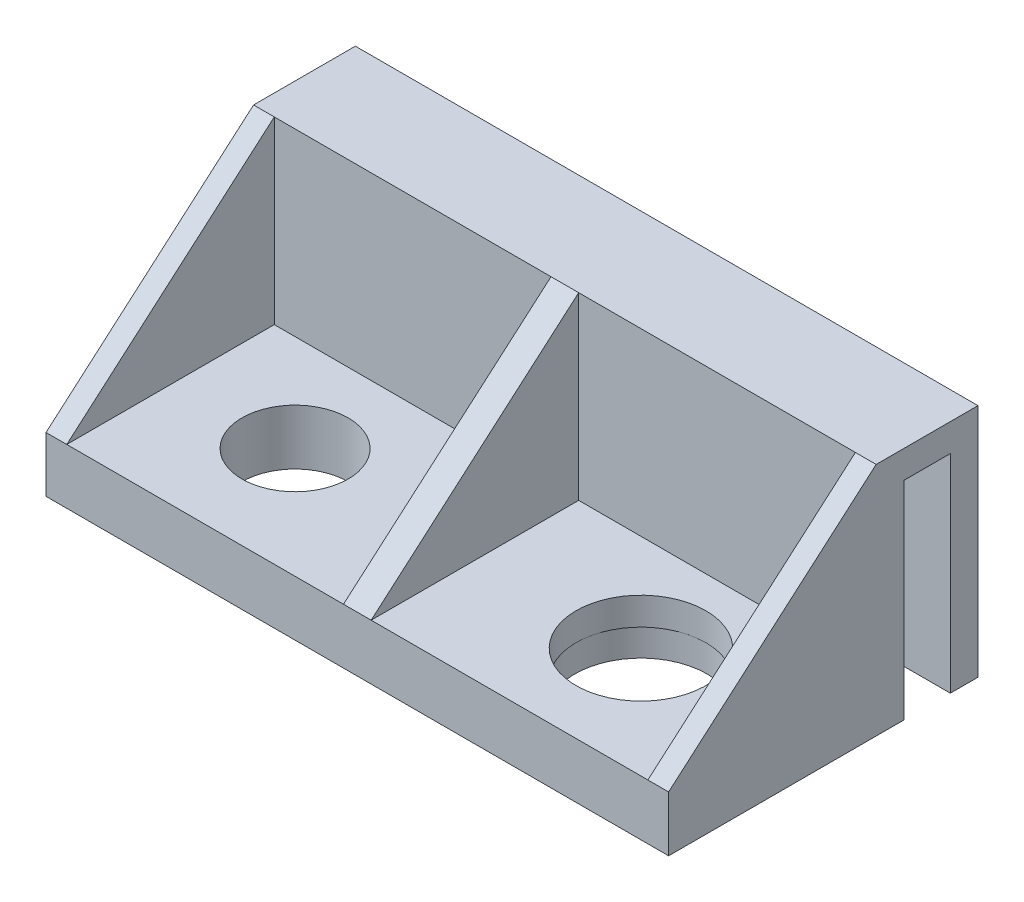
ISO-10303-21;
HEADER;
FILE_DESCRIPTION(('STEP AP214'),'2;1');
FILE_NAME('part.step','',(''),(''),'','','');
FILE_SCHEMA(('AUTOMOTIVE_DESIGN { 1 0 10303 214 1 1 1 1 }'));
ENDSEC;
DATA;
#1=APPLICATION_CONTEXT('core data for automotive mechanical design processes');
#2=APPLICATION_PROTOCOL_DEFINITION('international standard','automotive_design',2000,#1);
#3=PRODUCT_CONTEXT('',#1,'mechanical');
#4=PRODUCT('Part','Part','',(#3));
#5=PRODUCT_RELATED_PRODUCT_CATEGORY('part','',(#4));
#6=PRODUCT_DEFINITION_FORMATION('','',#4);
#7=PRODUCT_DEFINITION_CONTEXT('part definition',#1,'design');
#8=PRODUCT_DEFINITION('design','',#6,#7);
#9=PRODUCT_DEFINITION_SHAPE('','',#8);
#10=(LENGTH_UNIT() NAMED_UNIT(*) SI_UNIT(.MILLI.,.METRE.));
#11=(NAMED_UNIT(*) PLANE_ANGLE_UNIT() SI_UNIT($,.RADIAN.));
#12=(NAMED_UNIT(*) SI_UNIT($,.STERADIAN.) SOLID_ANGLE_UNIT());
#13=UNCERTAINTY_MEASURE_WITH_UNIT(LENGTH_MEASURE(1.E-05),#10,'distance_accuracy_value','');
#14=(GEOMETRIC_REPRESENTATION_CONTEXT(3) GLOBAL_UNCERTAINTY_ASSIGNED_CONTEXT((#13)) GLOBAL_UNIT_ASSIGNED_CONTEXT((#10,
#11,#12)) REPRESENTATION_CONTEXT('',''));
#15=CARTESIAN_POINT('',(0.,0.,0.));
#16=DIRECTION('',(0.,0.,1.));
#17=DIRECTION('',(1.,0.,0.));
#18=AXIS2_PLACEMENT_3D('',#15,#16,#17);
#19=CARTESIAN_POINT('',(22.5,17.,7.36));
#20=DIRECTION('',(0.,0.,-1.));
#21=DIRECTION('',(-1.,0.,0.));
#22=AXIS2_PLACEMENT_3D('',#19,#20,#21);
#23=PLANE('',#22);
#24=DIRECTION('',(0.,-1.,0.));
#25=VECTOR('',#24,1.);
#26=CARTESIAN_POINT('',(-1.,17.,7.36));
#27=LINE('',#26,#25);
#28=CARTESIAN_POINT('',(-1.,17.,7.36));
#29=VERTEX_POINT('',#28);
#30=CARTESIAN_POINT('',(-1.,4.,7.36));
#31=VERTEX_POINT('',#30);
#32=EDGE_CURVE('E154',#29,#31,#27,.T.);
#33=ORIENTED_EDGE('',*,*,#32,.F.);
#34=DIRECTION('',(-1.,0.,0.));
#35=VECTOR('',#34,1.);
#36=CARTESIAN_POINT('',(22.5,17.,7.36));
#37=LINE('',#36,#35);
#38=CARTESIAN_POINT('',(-21.,17.,7.36));
#39=VERTEX_POINT('',#38);
#40=EDGE_CURVE('E58',#29,#39,#37,.T.);
#41=ORIENTED_EDGE('',*,*,#40,.T.);
#42=DIRECTION('',(0.,1.,0.));
#43=VECTOR('',#42,1.);
#44=CARTESIAN_POINT('',(-21.,17.,7.36));
#45=LINE('',#44,#43);
#46=CARTESIAN_POINT('',(-21.,4.,7.36));
#47=VERTEX_POINT('',#46);
#48=EDGE_CURVE('E253',#47,#39,#45,.T.);
#49=ORIENTED_EDGE('',*,*,#48,.F.);
#50=DIRECTION('',(-1.,0.,0.));
#51=VECTOR('',#50,1.);
#52=CARTESIAN_POINT('',(22.5,4.,7.36));
#53=LINE('',#52,#51);
#54=EDGE_CURVE('E160',#31,#47,#53,.T.);
#55=ORIENTED_EDGE('',*,*,#54,.F.);
#56=EDGE_LOOP('',(#33,#41,#49,#55));
#57=FACE_BOUND('',#56,.T.);
#58=ADVANCED_FACE('F34',(#57),#23,.F.);
#59=CARTESIAN_POINT('',(22.5,4.,7.36));
#60=DIRECTION('',(0.,-1.,0.));
#61=DIRECTION('',(0.,0.,-1.));
#62=AXIS2_PLACEMENT_3D('',#59,#60,#61);
#63=PLANE('',#62);
#64=CARTESIAN_POINT('',(-12.5,4.,14.36));
#65=DIRECTION('',(0.,-1.,0.));
#66=DIRECTION('',(0.,0.,-1.));
#67=AXIS2_PLACEMENT_3D('',#64,#65,#66);
#68=CIRCLE('',#67,3.835);
#69=CARTESIAN_POINT('',(-12.5,4.,10.525));
#70=VERTEX_POINT('',#69);
#71=EDGE_CURVE('E268',#70,#70,#68,.T.);
#72=ORIENTED_EDGE('',*,*,#71,.T.);
#73=EDGE_LOOP('',(#72));
#74=FACE_BOUND('',#73,.T.);
#75=DIRECTION('',(0.,0.,1.));
#76=VECTOR('',#75,1.);
#77=CARTESIAN_POINT('',(-1.,4.,7.36));
#78=LINE('',#77,#76);
#79=CARTESIAN_POINT('',(-0.999999999999994,4.,22.36));
#80=VERTEX_POINT('',#79);
#81=EDGE_CURVE('E156',#31,#80,#78,.T.);
#82=ORIENTED_EDGE('',*,*,#81,.F.);
#83=ORIENTED_EDGE('',*,*,#54,.T.);
#84=DIRECTION('',(0.,0.,-1.));
#85=VECTOR('',#84,1.);
#86=CARTESIAN_POINT('',(-21.,4.,7.36));
#87=LINE('',#86,#85);
#88=CARTESIAN_POINT('',(-21.,4.,22.36));
#89=VERTEX_POINT('',#88);
#90=EDGE_CURVE('E248',#89,#47,#87,.T.);
#91=ORIENTED_EDGE('',*,*,#90,.F.);
#92=DIRECTION('',(-1.,0.,0.));
#93=VECTOR('',#92,1.);
#94=CARTESIAN_POINT('',(22.5,4.,22.36));
#95=LINE('',#94,#93);
#96=EDGE_CURVE('E212',#80,#89,#95,.T.);
#97=ORIENTED_EDGE('',*,*,#96,.F.);
#98=EDGE_LOOP('',(#82,#83,#91,#97));
#99=FACE_BOUND('',#98,.T.);
#100=ADVANCED_FACE('F336',(#74,#99),#63,.F.);
#101=CARTESIAN_POINT('',(21.,17.,7.36));
#102=VERTEX_POINT('',#101);
#103=CARTESIAN_POINT('',(1.,17.,7.36));
#104=VERTEX_POINT('',#103);
#105=EDGE_CURVE('E167',#102,#104,#37,.T.);
#106=ORIENTED_EDGE('',*,*,#105,.T.);
#107=DIRECTION('',(0.,-1.,0.));
#108=VECTOR('',#107,1.);
#109=CARTESIAN_POINT('',(1.,17.,7.36));
#110=LINE('',#109,#108);
#111=CARTESIAN_POINT('',(1.,4.,7.36));
#112=VERTEX_POINT('',#111);
#113=EDGE_CURVE('E150',#104,#112,#110,.T.);
#114=ORIENTED_EDGE('',*,*,#113,.T.);
#115=CARTESIAN_POINT('',(21.,4.,7.36));
#116=VERTEX_POINT('',#115);
#117=EDGE_CURVE('E168',#116,#112,#53,.T.);
#118=ORIENTED_EDGE('',*,*,#117,.F.);
#119=DIRECTION('',(0.,-1.,0.));
#120=VECTOR('',#119,1.);
#121=CARTESIAN_POINT('',(21.,17.,7.36));
#122=LINE('',#121,#120);
#123=EDGE_CURVE('E244',#102,#116,#122,.T.);
#124=ORIENTED_EDGE('',*,*,#123,.F.);
#125=EDGE_LOOP('',(#106,#114,#118,#124));
#126=FACE_BOUND('',#125,.T.);
#127=ADVANCED_FACE('F338',(#126),#23,.F.);
#128=CARTESIAN_POINT('',(12.5,4.,14.36));
#129=DIRECTION('',(0.,-1.,0.));
#130=DIRECTION('',(0.,0.,-1.));
#131=AXIS2_PLACEMENT_3D('',#128,#129,#130);
#132=CIRCLE('',#131,4.69);
#133=CARTESIAN_POINT('',(12.5,4.,9.67));
#134=VERTEX_POINT('',#133);
#135=EDGE_CURVE('E271',#134,#134,#132,.T.);
#136=ORIENTED_EDGE('',*,*,#135,.T.);
#137=EDGE_LOOP('',(#136));
#138=FACE_BOUND('',#137,.T.);
#139=ORIENTED_EDGE('',*,*,#117,.T.);
#140=DIRECTION('',(0.,0.,1.));
#141=VECTOR('',#140,1.);
#142=CARTESIAN_POINT('',(1.,4.,7.36));
#143=LINE('',#142,#141);
#144=CARTESIAN_POINT('',(1.,4.,22.36));
#145=VERTEX_POINT('',#144);
#146=EDGE_CURVE('E161',#112,#145,#143,.T.);
#147=ORIENTED_EDGE('',*,*,#146,.T.);
#148=CARTESIAN_POINT('',(21.,4.,22.36));
#149=VERTEX_POINT('',#148);
#150=EDGE_CURVE('E216',#149,#145,#95,.T.);
#151=ORIENTED_EDGE('',*,*,#150,.F.);
#152=DIRECTION('',(0.,0.,1.));
#153=VECTOR('',#152,1.);
#154=CARTESIAN_POINT('',(21.,4.,7.36));
#155=LINE('',#154,#153);
#156=EDGE_CURVE('E241',#116,#149,#155,.T.);
#157=ORIENTED_EDGE('',*,*,#156,.F.);
#158=EDGE_LOOP('',(#139,#147,#151,#157));
#159=FACE_BOUND('',#158,.T.);
#160=ADVANCED_FACE('F232',(#138,#159),#63,.F.);
#161=CARTESIAN_POINT('',(12.5,10.,14.36));
#162=DIRECTION('',(0.,-1.,0.));
#163=DIRECTION('',(0.,0.,-1.));
#164=AXIS2_PLACEMENT_3D('',#161,#162,#163);
#165=CYLINDRICAL_SURFACE('',#164,4.69);
#166=ORIENTED_EDGE('',*,*,#135,.F.);
#167=EDGE_LOOP('',(#166));
#168=FACE_BOUND('',#167,.T.);
#169=CARTESIAN_POINT('',(12.5,2.,14.36));
#170=DIRECTION('',(0.,-1.,0.));
#171=DIRECTION('',(0.,0.,-1.));
#172=AXIS2_PLACEMENT_3D('',#169,#170,#171);
#173=CIRCLE('',#172,4.69);
#174=CARTESIAN_POINT('',(12.5,2.,9.67));
#175=VERTEX_POINT('',#174);
#176=EDGE_CURVE('E38',#175,#175,#173,.F.);
#177=ORIENTED_EDGE('',*,*,#176,.F.);
#178=EDGE_LOOP('',(#177));
#179=FACE_BOUND('',#178,.T.);
#180=ADVANCED_FACE('F349',(#168,#179),#165,.F.);
#181=CARTESIAN_POINT('',(22.5,-13.,0.));
#182=DIRECTION('',(0.,0.,1.));
#183=DIRECTION('',(1.,0.,0.));
#184=AXIS2_PLACEMENT_3D('',#181,#182,#183);
#185=PLANE('',#184);
#186=DIRECTION('',(0.,1.,0.));
#187=VECTOR('',#186,1.);
#188=CARTESIAN_POINT('',(22.5,-13.,0.));
#189=LINE('',#188,#187);
#190=CARTESIAN_POINT('',(22.5,0.,0.));
#191=VERTEX_POINT('',#190);
#192=CARTESIAN_POINT('',(22.5,17.,0.));
#193=VERTEX_POINT('',#192);
#194=EDGE_CURVE('E209',#191,#193,#189,.T.);
#195=ORIENTED_EDGE('',*,*,#194,.F.);
#196=DIRECTION('',(1.,0.,0.));
#197=VECTOR('',#196,1.);
#198=CARTESIAN_POINT('',(-22.5,0.,0.));
#199=LINE('',#198,#197);
#200=CARTESIAN_POINT('',(-22.5,0.,0.));
#201=VERTEX_POINT('',#200);
#202=EDGE_CURVE('E190',#201,#191,#199,.T.);
#203=ORIENTED_EDGE('',*,*,#202,.F.);
#204=DIRECTION('',(0.,1.,0.));
#205=VECTOR('',#204,1.);
#206=CARTESIAN_POINT('',(-22.5,-13.,0.));
#207=LINE('',#206,#205);
#208=CARTESIAN_POINT('',(-22.5,17.,0.));
#209=VERTEX_POINT('',#208);
#210=EDGE_CURVE('E189',#201,#209,#207,.T.);
#211=ORIENTED_EDGE('',*,*,#210,.T.);
#212=DIRECTION('',(-1.,0.,0.));
#213=VECTOR('',#212,1.);
#214=CARTESIAN_POINT('',(22.5,17.,0.));
#215=LINE('',#214,#213);
#216=EDGE_CURVE('E43',#193,#209,#215,.T.);
#217=ORIENTED_EDGE('',*,*,#216,.F.);
#218=EDGE_LOOP('',(#195,#203,#211,#217));
#219=FACE_BOUND('',#218,.T.);
#220=ADVANCED_FACE('F36',(#219),#185,.F.);
#221=CARTESIAN_POINT('',(22.5,17.,0.));
#222=DIRECTION('',(0.,-1.,0.));
#223=DIRECTION('',(0.,0.,-1.));
#224=AXIS2_PLACEMENT_3D('',#221,#222,#223);
#225=PLANE('',#224);
#226=ORIENTED_EDGE('',*,*,#216,.T.);
#227=DIRECTION('',(0.,0.,1.));
#228=VECTOR('',#227,1.);
#229=CARTESIAN_POINT('',(-22.5,17.,0.));
#230=LINE('',#229,#228);
#231=CARTESIAN_POINT('',(-22.5,17.,7.36));
#232=VERTEX_POINT('',#231);
#233=EDGE_CURVE('E182',#209,#232,#230,.T.);
#234=ORIENTED_EDGE('',*,*,#233,.T.);
#235=DIRECTION('',(1.,0.,0.));
#236=VECTOR('',#235,1.);
#237=CARTESIAN_POINT('',(22.5,17.,7.36));
#238=LINE('',#237,#236);
#239=EDGE_CURVE('E165',#232,#39,#238,.T.);
#240=ORIENTED_EDGE('',*,*,#239,.T.);
#241=ORIENTED_EDGE('',*,*,#40,.F.);
#242=DIRECTION('',(1.,0.,0.));
#243=VECTOR('',#242,1.);
#244=CARTESIAN_POINT('',(22.5,17.,7.36));
#245=LINE('',#244,#243);
#246=EDGE_CURVE('E142',#104,#29,#245,.F.);
#247=ORIENTED_EDGE('',*,*,#246,.F.);
#248=ORIENTED_EDGE('',*,*,#105,.F.);
#249=CARTESIAN_POINT('',(22.5,17.,7.36));
#250=VERTEX_POINT('',#249);
#251=EDGE_CURVE('E170',#250,#102,#37,.T.);
#252=ORIENTED_EDGE('',*,*,#251,.F.);
#253=DIRECTION('',(0.,0.,1.));
#254=VECTOR('',#253,1.);
#255=CARTESIAN_POINT('',(22.5,17.,0.));
#256=LINE('',#255,#254);
#257=EDGE_CURVE('E184',#193,#250,#256,.T.);
#258=ORIENTED_EDGE('',*,*,#257,.F.);
#259=EDGE_LOOP('',(#226,#234,#240,#241,#247,#248,#252,#258));
#260=FACE_BOUND('',#259,.T.);
#261=ADVANCED_FACE('F163',(#260),#225,.F.);
#262=CARTESIAN_POINT('',(22.5,4.,22.36));
#263=DIRECTION('',(0.,0.,-1.));
#264=DIRECTION('',(0.,1.,0.));
#265=AXIS2_PLACEMENT_3D('',#262,#263,#264);
#266=PLANE('',#265);
#267=ORIENTED_EDGE('',*,*,#150,.T.);
#268=EDGE_CURVE('E221',#145,#80,#95,.T.);
#269=ORIENTED_EDGE('',*,*,#268,.T.);
#270=ORIENTED_EDGE('',*,*,#96,.T.);
#271=DIRECTION('',(1.,0.,0.));
#272=VECTOR('',#271,1.);
#273=CARTESIAN_POINT('',(22.5,4.,22.36));
#274=LINE('',#273,#272);
#275=CARTESIAN_POINT('',(-22.5,4.,22.36));
#276=VERTEX_POINT('',#275);
#277=EDGE_CURVE('E255',#276,#89,#274,.T.);
#278=ORIENTED_EDGE('',*,*,#277,.F.);
#279=DIRECTION('',(0.,-1.,0.));
#280=VECTOR('',#279,1.);
#281=CARTESIAN_POINT('',(-22.5,4.,22.36));
#282=LINE('',#281,#280);
#283=CARTESIAN_POINT('',(-22.5,0.,22.36));
#284=VERTEX_POINT('',#283);
#285=EDGE_CURVE('E200',#276,#284,#282,.T.);
#286=ORIENTED_EDGE('',*,*,#285,.T.);
#287=DIRECTION('',(-1.,0.,0.));
#288=VECTOR('',#287,1.);
#289=CARTESIAN_POINT('',(22.5,0.,22.36));
#290=LINE('',#289,#288);
#291=CARTESIAN_POINT('',(22.5,0.,22.36));
#292=VERTEX_POINT('',#291);
#293=EDGE_CURVE('E210',#292,#284,#290,.T.);
#294=ORIENTED_EDGE('',*,*,#293,.F.);
#295=DIRECTION('',(0.,-1.,0.));
#296=VECTOR('',#295,1.);
#297=CARTESIAN_POINT('',(22.5,4.,22.36));
#298=LINE('',#297,#296);
#299=CARTESIAN_POINT('',(22.5,4.,22.36));
#300=VERTEX_POINT('',#299);
#301=EDGE_CURVE('E304',#300,#292,#298,.T.);
#302=ORIENTED_EDGE('',*,*,#301,.F.);
#303=EDGE_CURVE('E214',#300,#149,#95,.T.);
#304=ORIENTED_EDGE('',*,*,#303,.T.);
#305=EDGE_LOOP('',(#267,#269,#270,#278,#286,#294,#302,#304));
#306=FACE_BOUND('',#305,.T.);
#307=ADVANCED_FACE('F224',(#306),#266,.F.);
#308=CARTESIAN_POINT('',(22.5,0.,22.36));
#309=DIRECTION('',(0.,1.,0.));
#310=DIRECTION('',(0.,0.,1.));
#311=AXIS2_PLACEMENT_3D('',#308,#309,#310);
#312=PLANE('',#311);
#313=ORIENTED_EDGE('',*,*,#293,.T.);
#314=DIRECTION('',(0.,0.,-1.));
#315=VECTOR('',#314,1.);
#316=CARTESIAN_POINT('',(-22.5,0.,22.36));
#317=LINE('',#316,#315);
#318=CARTESIAN_POINT('',(-22.5,0.,5.36));
#319=VERTEX_POINT('',#318);
#320=EDGE_CURVE('E203',#284,#319,#317,.T.);
#321=ORIENTED_EDGE('',*,*,#320,.T.);
#322=DIRECTION('',(-1.,0.,0.));
#323=VECTOR('',#322,1.);
#324=CARTESIAN_POINT('',(-22.5,0.,5.36));
#325=LINE('',#324,#323);
#326=CARTESIAN_POINT('',(22.5,0.,5.36));
#327=VERTEX_POINT('',#326);
#328=EDGE_CURVE('E11',#327,#319,#325,.T.);
#329=ORIENTED_EDGE('',*,*,#328,.F.);
#330=DIRECTION('',(0.,0.,-1.));
#331=VECTOR('',#330,1.);
#332=CARTESIAN_POINT('',(22.5,0.,22.36));
#333=LINE('',#332,#331);
#334=EDGE_CURVE('E213',#292,#327,#333,.T.);
#335=ORIENTED_EDGE('',*,*,#334,.F.);
#336=EDGE_LOOP('',(#313,#321,#329,#335));
#337=FACE_BOUND('',#336,.T.);
#338=CARTESIAN_POINT('',(12.5,0.,14.36));
#339=DIRECTION('',(0.,-1.,0.));
#340=DIRECTION('',(0.,0.,-1.));
#341=AXIS2_PLACEMENT_3D('',#338,#339,#340);
#342=CIRCLE('',#341,4.775);
#343=CARTESIAN_POINT('',(12.5,0.,9.585));
#344=VERTEX_POINT('',#343);
#345=EDGE_CURVE('E259',#344,#344,#342,.T.);
#346=ORIENTED_EDGE('',*,*,#345,.F.);
#347=EDGE_LOOP('',(#346));
#348=FACE_BOUND('',#347,.T.);
#349=CARTESIAN_POINT('',(-12.5,0.,14.36));
#350=DIRECTION('',(0.,-1.,0.));
#351=DIRECTION('',(0.,0.,-1.));
#352=AXIS2_PLACEMENT_3D('',#349,#350,#351);
#353=CIRCLE('',#352,3.835);
#354=CARTESIAN_POINT('',(-12.5,0.,10.525));
#355=VERTEX_POINT('',#354);
#356=EDGE_CURVE('E265',#355,#355,#353,.T.);
#357=ORIENTED_EDGE('',*,*,#356,.F.);
#358=EDGE_LOOP('',(#357));
#359=FACE_BOUND('',#358,.T.);
#360=ADVANCED_FACE('F314',(#337,#348,#359),#312,.F.);
#361=CARTESIAN_POINT('',(22.5,0.,0.));
#362=DIRECTION('',(1.,0.,0.));
#363=DIRECTION('',(0.,0.,-1.));
#364=AXIS2_PLACEMENT_3D('',#361,#362,#363);
#365=PLANE('',#364);
#366=DIRECTION('',(0.,0.,1.));
#367=VECTOR('',#366,1.);
#368=CARTESIAN_POINT('',(22.5,0.,7.36));
#369=LINE('',#368,#367);
#370=CARTESIAN_POINT('',(22.5,0.,2.00000000000001));
#371=VERTEX_POINT('',#370);
#372=EDGE_CURVE('E274',#191,#371,#369,.T.);
#373=ORIENTED_EDGE('',*,*,#372,.F.);
#374=ORIENTED_EDGE('',*,*,#194,.T.);
#375=ORIENTED_EDGE('',*,*,#257,.T.);
#376=DIRECTION('',(0.,0.654930538417842,-0.755689082789818));
#377=VECTOR('',#376,1.);
#378=CARTESIAN_POINT('',(22.5,4.,22.36));
#379=LINE('',#378,#377);
#380=EDGE_CURVE('E239',#300,#250,#379,.T.);
#381=ORIENTED_EDGE('',*,*,#380,.F.);
#382=ORIENTED_EDGE('',*,*,#301,.T.);
#383=ORIENTED_EDGE('',*,*,#334,.T.);
#384=DIRECTION('',(0.,-1.,0.));
#385=VECTOR('',#384,1.);
#386=CARTESIAN_POINT('',(22.5,-13.,5.36));
#387=LINE('',#386,#385);
#388=CARTESIAN_POINT('',(22.5,15.,5.36));
#389=VERTEX_POINT('',#388);
#390=EDGE_CURVE('E286',#389,#327,#387,.T.);
#391=ORIENTED_EDGE('',*,*,#390,.F.);
#392=DIRECTION('',(0.,0.,1.));
#393=VECTOR('',#392,1.);
#394=CARTESIAN_POINT('',(22.5,15.,2.00000000000001));
#395=LINE('',#394,#393);
#396=CARTESIAN_POINT('',(22.5,15.,2.00000000000001));
#397=VERTEX_POINT('',#396);
#398=EDGE_CURVE('E295',#397,#389,#395,.T.);
#399=ORIENTED_EDGE('',*,*,#398,.F.);
#400=DIRECTION('',(0.,1.,0.));
#401=VECTOR('',#400,1.);
#402=CARTESIAN_POINT('',(22.5,-13.,2.));
#403=LINE('',#402,#401);
#404=EDGE_CURVE('E282',#371,#397,#403,.T.);
#405=ORIENTED_EDGE('',*,*,#404,.F.);
#406=EDGE_LOOP('',(#373,#374,#375,#381,#382,#383,#391,#399,#405));
#407=FACE_BOUND('',#406,.T.);
#408=ADVANCED_FACE('F310',(#407),#365,.T.);
#409=CARTESIAN_POINT('',(-22.5,0.,0.));
#410=DIRECTION('',(1.,0.,0.));
#411=DIRECTION('',(0.,0.,-1.));
#412=AXIS2_PLACEMENT_3D('',#409,#410,#411);
#413=PLANE('',#412);
#414=ORIENTED_EDGE('',*,*,#285,.F.);
#415=DIRECTION('',(0.,0.654930538417842,-0.755689082789818));
#416=VECTOR('',#415,1.);
#417=CARTESIAN_POINT('',(-22.5,4.,22.36));
#418=LINE('',#417,#416);
#419=EDGE_CURVE('E199',#276,#232,#418,.T.);
#420=ORIENTED_EDGE('',*,*,#419,.T.);
#421=ORIENTED_EDGE('',*,*,#233,.F.);
#422=ORIENTED_EDGE('',*,*,#210,.F.);
#423=DIRECTION('',(0.,0.,1.));
#424=VECTOR('',#423,1.);
#425=CARTESIAN_POINT('',(-22.5,0.,7.36));
#426=LINE('',#425,#424);
#427=CARTESIAN_POINT('',(-22.5,0.,2.));
#428=VERTEX_POINT('',#427);
#429=EDGE_CURVE('E275',#201,#428,#426,.T.);
#430=ORIENTED_EDGE('',*,*,#429,.T.);
#431=DIRECTION('',(0.,1.,0.));
#432=VECTOR('',#431,1.);
#433=CARTESIAN_POINT('',(-22.5,-13.,2.));
#434=LINE('',#433,#432);
#435=CARTESIAN_POINT('',(-22.5,15.,2.00000000000001));
#436=VERTEX_POINT('',#435);
#437=EDGE_CURVE('E283',#428,#436,#434,.T.);
#438=ORIENTED_EDGE('',*,*,#437,.T.);
#439=DIRECTION('',(0.,0.,1.));
#440=VECTOR('',#439,1.);
#441=CARTESIAN_POINT('',(-22.5,15.,2.00000000000001));
#442=LINE('',#441,#440);
#443=CARTESIAN_POINT('',(-22.5,15.,5.36));
#444=VERTEX_POINT('',#443);
#445=EDGE_CURVE('E285',#436,#444,#442,.T.);
#446=ORIENTED_EDGE('',*,*,#445,.T.);
#447=DIRECTION('',(0.,-1.,0.));
#448=VECTOR('',#447,1.);
#449=CARTESIAN_POINT('',(-22.5,-13.,5.36));
#450=LINE('',#449,#448);
#451=EDGE_CURVE('E289',#444,#319,#450,.T.);
#452=ORIENTED_EDGE('',*,*,#451,.T.);
#453=ORIENTED_EDGE('',*,*,#320,.F.);
#454=EDGE_LOOP('',(#414,#420,#421,#422,#430,#438,#446,#452,#453));
#455=FACE_BOUND('',#454,.T.);
#456=ADVANCED_FACE('F197',(#455),#413,.F.);
#457=CARTESIAN_POINT('',(-22.5,-13.,2.));
#458=DIRECTION('',(0.,0.,-1.));
#459=DIRECTION('',(0.,1.,0.));
#460=AXIS2_PLACEMENT_3D('',#457,#458,#459);
#461=PLANE('',#460);
#462=ORIENTED_EDGE('',*,*,#404,.T.);
#463=DIRECTION('',(1.,0.,0.));
#464=VECTOR('',#463,1.);
#465=CARTESIAN_POINT('',(-22.5,15.,2.00000000000001));
#466=LINE('',#465,#464);
#467=EDGE_CURVE('E292',#436,#397,#466,.T.);
#468=ORIENTED_EDGE('',*,*,#467,.F.);
#469=ORIENTED_EDGE('',*,*,#437,.F.);
#470=DIRECTION('',(1.,0.,0.));
#471=VECTOR('',#470,1.);
#472=CARTESIAN_POINT('',(-22.5,0.,2.00000000000001));
#473=LINE('',#472,#471);
#474=EDGE_CURVE('E280',#428,#371,#473,.T.);
#475=ORIENTED_EDGE('',*,*,#474,.T.);
#476=EDGE_LOOP('',(#462,#468,#469,#475));
#477=FACE_BOUND('',#476,.T.);
#478=ADVANCED_FACE('F326',(#477),#461,.F.);
#479=CARTESIAN_POINT('',(-22.5,-13.,5.36));
#480=DIRECTION('',(0.,0.,1.));
#481=DIRECTION('',(1.,0.,0.));
#482=AXIS2_PLACEMENT_3D('',#479,#480,#481);
#483=PLANE('',#482);
#484=ORIENTED_EDGE('',*,*,#328,.T.);
#485=ORIENTED_EDGE('',*,*,#451,.F.);
#486=DIRECTION('',(1.,0.,0.));
#487=VECTOR('',#486,1.);
#488=CARTESIAN_POINT('',(-22.5,15.,5.36));
#489=LINE('',#488,#487);
#490=EDGE_CURVE('E193',#444,#389,#489,.T.);
#491=ORIENTED_EDGE('',*,*,#490,.T.);
#492=ORIENTED_EDGE('',*,*,#390,.T.);
#493=EDGE_LOOP('',(#484,#485,#491,#492));
#494=FACE_BOUND('',#493,.T.);
#495=ADVANCED_FACE('F318',(#494),#483,.F.);
#496=CARTESIAN_POINT('',(-22.5,15.,2.00000000000001));
#497=DIRECTION('',(0.,1.,0.));
#498=DIRECTION('',(0.,0.,1.));
#499=AXIS2_PLACEMENT_3D('',#496,#497,#498);
#500=PLANE('',#499);
#501=ORIENTED_EDGE('',*,*,#398,.T.);
#502=ORIENTED_EDGE('',*,*,#490,.F.);
#503=ORIENTED_EDGE('',*,*,#445,.F.);
#504=ORIENTED_EDGE('',*,*,#467,.T.);
#505=EDGE_LOOP('',(#501,#502,#503,#504));
#506=FACE_BOUND('',#505,.T.);
#507=ADVANCED_FACE('F322',(#506),#500,.F.);
#508=CARTESIAN_POINT('',(-22.5,0.,7.36));
#509=DIRECTION('',(0.,1.,0.));
#510=DIRECTION('',(0.,0.,1.));
#511=AXIS2_PLACEMENT_3D('',#508,#509,#510);
#512=PLANE('',#511);
#513=ORIENTED_EDGE('',*,*,#372,.T.);
#514=ORIENTED_EDGE('',*,*,#474,.F.);
#515=ORIENTED_EDGE('',*,*,#429,.F.);
#516=ORIENTED_EDGE('',*,*,#202,.T.);
#517=EDGE_LOOP('',(#513,#514,#515,#516));
#518=FACE_BOUND('',#517,.T.);
#519=ADVANCED_FACE('F329',(#518),#512,.F.);
#520=CARTESIAN_POINT('',(-12.5,10.,14.36));
#521=DIRECTION('',(0.,-1.,0.));
#522=DIRECTION('',(0.,0.,-1.));
#523=AXIS2_PLACEMENT_3D('',#520,#521,#522);
#524=CYLINDRICAL_SURFACE('',#523,3.835);
#525=ORIENTED_EDGE('',*,*,#356,.T.);
#526=EDGE_LOOP('',(#525));
#527=FACE_BOUND('',#526,.T.);
#528=ORIENTED_EDGE('',*,*,#71,.F.);
#529=EDGE_LOOP('',(#528));
#530=FACE_BOUND('',#529,.T.);
#531=ADVANCED_FACE('F364',(#527,#530),#524,.F.);
#532=CARTESIAN_POINT('',(12.5,2.,14.36));
#533=DIRECTION('',(0.,-1.,0.));
#534=DIRECTION('',(0.,0.,-1.));
#535=AXIS2_PLACEMENT_3D('',#532,#533,#534);
#536=PLANE('',#535);
#537=CARTESIAN_POINT('',(12.5,2.,14.36));
#538=DIRECTION('',(0.,-1.,0.));
#539=DIRECTION('',(0.,0.,-1.));
#540=AXIS2_PLACEMENT_3D('',#537,#538,#539);
#541=CIRCLE('',#540,4.775);
#542=CARTESIAN_POINT('',(12.5,2.,9.585));
#543=VERTEX_POINT('',#542);
#544=EDGE_CURVE('E260',#543,#543,#541,.T.);
#545=ORIENTED_EDGE('',*,*,#544,.T.);
#546=EDGE_LOOP('',(#545));
#547=FACE_BOUND('',#546,.T.);
#548=ORIENTED_EDGE('',*,*,#176,.T.);
#549=EDGE_LOOP('',(#548));
#550=FACE_BOUND('',#549,.T.);
#551=ADVANCED_FACE('F361',(#547,#550),#536,.T.);
#552=CARTESIAN_POINT('',(12.5,2.,14.36));
#553=DIRECTION('',(0.,-1.,0.));
#554=DIRECTION('',(0.,0.,-1.));
#555=AXIS2_PLACEMENT_3D('',#552,#553,#554);
#556=CYLINDRICAL_SURFACE('',#555,4.775);
#557=ORIENTED_EDGE('',*,*,#544,.F.);
#558=EDGE_LOOP('',(#557));
#559=FACE_BOUND('',#558,.T.);
#560=ORIENTED_EDGE('',*,*,#345,.T.);
#561=EDGE_LOOP('',(#560));
#562=FACE_BOUND('',#561,.T.);
#563=ADVANCED_FACE('F363',(#559,#562),#556,.F.);
#564=CARTESIAN_POINT('',(-22.5,4.,22.36));
#565=DIRECTION('',(0.,0.755689082789818,0.654930538417842));
#566=DIRECTION('',(0.,0.654930538417842,-0.755689082789818));
#567=AXIS2_PLACEMENT_3D('',#564,#565,#566);
#568=PLANE('',#567);
#569=ORIENTED_EDGE('',*,*,#239,.F.);
#570=ORIENTED_EDGE('',*,*,#419,.F.);
#571=ORIENTED_EDGE('',*,*,#277,.T.);
#572=DIRECTION('',(0.,0.654930538417842,-0.755689082789818));
#573=VECTOR('',#572,1.);
#574=CARTESIAN_POINT('',(-21.,4.,22.36));
#575=LINE('',#574,#573);
#576=EDGE_CURVE('E246',#89,#39,#575,.T.);
#577=ORIENTED_EDGE('',*,*,#576,.T.);
#578=EDGE_LOOP('',(#569,#570,#571,#577));
#579=FACE_BOUND('',#578,.T.);
#580=ADVANCED_FACE('F331',(#579),#568,.T.);
#581=CARTESIAN_POINT('',(-21.,8.5,11.18));
#582=DIRECTION('',(-1.,0.,0.));
#583=DIRECTION('',(0.,0.,1.));
#584=AXIS2_PLACEMENT_3D('',#581,#582,#583);
#585=PLANE('',#584);
#586=ORIENTED_EDGE('',*,*,#90,.T.);
#587=ORIENTED_EDGE('',*,*,#48,.T.);
#588=ORIENTED_EDGE('',*,*,#576,.F.);
#589=EDGE_LOOP('',(#586,#587,#588));
#590=FACE_BOUND('',#589,.T.);
#591=ADVANCED_FACE('F334',(#590),#585,.F.);
#592=CARTESIAN_POINT('',(21.,8.5,11.18));
#593=DIRECTION('',(1.,0.,0.));
#594=DIRECTION('',(0.,0.,-1.));
#595=AXIS2_PLACEMENT_3D('',#592,#593,#594);
#596=PLANE('',#595);
#597=DIRECTION('',(0.,0.654930538417842,-0.755689082789818));
#598=VECTOR('',#597,1.);
#599=CARTESIAN_POINT('',(21.,4.,22.36));
#600=LINE('',#599,#598);
#601=EDGE_CURVE('E149',#149,#102,#600,.T.);
#602=ORIENTED_EDGE('',*,*,#601,.T.);
#603=ORIENTED_EDGE('',*,*,#123,.T.);
#604=ORIENTED_EDGE('',*,*,#156,.T.);
#605=EDGE_LOOP('',(#602,#603,#604));
#606=FACE_BOUND('',#605,.T.);
#607=ADVANCED_FACE('F440',(#606),#596,.F.);
#608=CARTESIAN_POINT('',(22.5,4.,22.36));
#609=DIRECTION('',(0.,-0.755689082789818,-0.654930538417842));
#610=DIRECTION('',(0.,0.654930538417842,-0.755689082789818));
#611=AXIS2_PLACEMENT_3D('',#608,#609,#610);
#612=PLANE('',#611);
#613=ORIENTED_EDGE('',*,*,#380,.T.);
#614=ORIENTED_EDGE('',*,*,#251,.T.);
#615=ORIENTED_EDGE('',*,*,#601,.F.);
#616=ORIENTED_EDGE('',*,*,#303,.F.);
#617=EDGE_LOOP('',(#613,#614,#615,#616));
#618=FACE_BOUND('',#617,.T.);
#619=ADVANCED_FACE('F457',(#618),#612,.F.);
#620=CARTESIAN_POINT('',(1.,8.5,11.18));
#621=DIRECTION('',(1.,0.,0.));
#622=DIRECTION('',(0.,0.,-1.));
#623=AXIS2_PLACEMENT_3D('',#620,#621,#622);
#624=PLANE('',#623);
#625=ORIENTED_EDGE('',*,*,#113,.F.);
#626=DIRECTION('',(0.,0.654930538417842,-0.755689082789818));
#627=VECTOR('',#626,1.);
#628=CARTESIAN_POINT('',(1.,4.,22.36));
#629=LINE('',#628,#627);
#630=EDGE_CURVE('E145',#145,#104,#629,.T.);
#631=ORIENTED_EDGE('',*,*,#630,.F.);
#632=ORIENTED_EDGE('',*,*,#146,.F.);
#633=EDGE_LOOP('',(#625,#631,#632));
#634=FACE_BOUND('',#633,.T.);
#635=ADVANCED_FACE('F228',(#634),#624,.T.);
#636=CARTESIAN_POINT('',(-1.,8.5,11.18));
#637=DIRECTION('',(1.,0.,0.));
#638=DIRECTION('',(0.,0.,-1.));
#639=AXIS2_PLACEMENT_3D('',#636,#637,#638);
#640=PLANE('',#639);
#641=DIRECTION('',(0.,0.654930538417842,-0.755689082789818));
#642=VECTOR('',#641,1.);
#643=CARTESIAN_POINT('',(-1.,4.,22.36));
#644=LINE('',#643,#642);
#645=EDGE_CURVE('E50',#80,#29,#644,.T.);
#646=ORIENTED_EDGE('',*,*,#645,.T.);
#647=ORIENTED_EDGE('',*,*,#32,.T.);
#648=ORIENTED_EDGE('',*,*,#81,.T.);
#649=EDGE_LOOP('',(#646,#647,#648));
#650=FACE_BOUND('',#649,.T.);
#651=ADVANCED_FACE('F153',(#650),#640,.F.);
#652=CARTESIAN_POINT('',(0.,4.,22.36));
#653=DIRECTION('',(0.,-0.755689082789818,-0.654930538417842));
#654=DIRECTION('',(0.,0.654930538417842,-0.755689082789818));
#655=AXIS2_PLACEMENT_3D('',#652,#653,#654);
#656=PLANE('',#655);
#657=ORIENTED_EDGE('',*,*,#630,.T.);
#658=ORIENTED_EDGE('',*,*,#246,.T.);
#659=ORIENTED_EDGE('',*,*,#645,.F.);
#660=ORIENTED_EDGE('',*,*,#268,.F.);
#661=EDGE_LOOP('',(#657,#658,#659,#660));
#662=FACE_BOUND('',#661,.T.);
#663=ADVANCED_FACE('F143',(#662),#656,.F.);
#664=CLOSED_SHELL('',(#58,#100,#127,#160,#180,#220,#261,#307,#360,#408,#456,#478,#495,#507,#519,
#531,#551,#563,#580,#591,#607,#619,#635,#651,#663));
#665=MANIFOLD_SOLID_BREP('B2',#664);
#666=ADVANCED_BREP_SHAPE_REPRESENTATION('',(#18,#665),#14);
#667=SHAPE_DEFINITION_REPRESENTATION(#9,#666);
ENDSEC;
END-ISO-10303-21;
